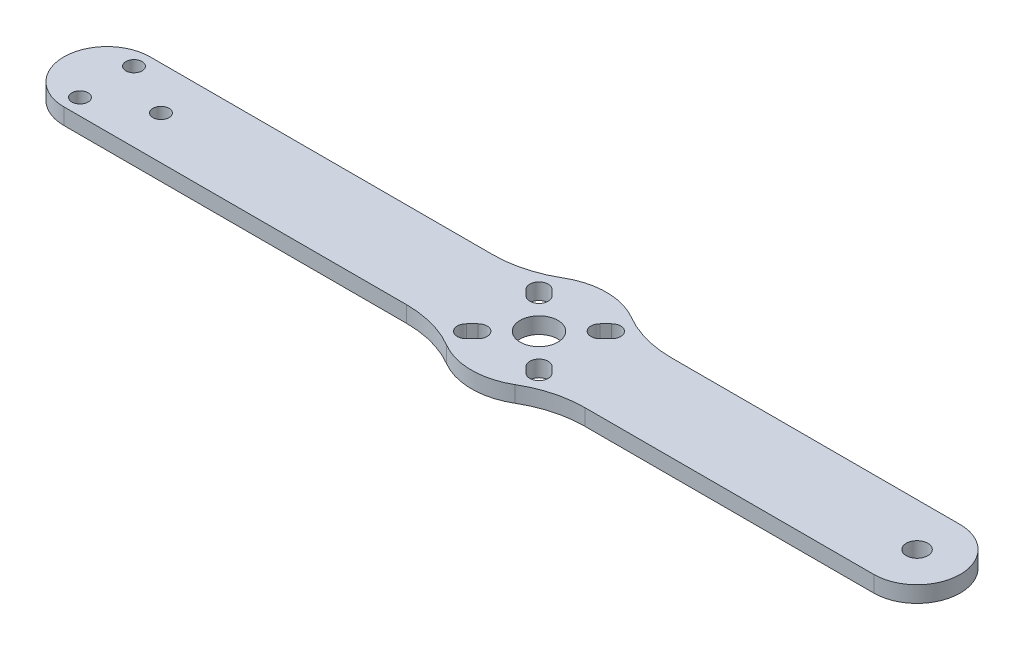
ISO-10303-21;
HEADER;
FILE_DESCRIPTION(('STEP AP214'),'2;1');
FILE_NAME('part.step','',(''),(''),'','','');
FILE_SCHEMA(('AUTOMOTIVE_DESIGN { 1 0 10303 214 1 1 1 1 }'));
ENDSEC;
DATA;
#1=APPLICATION_CONTEXT('core data for automotive mechanical design processes');
#2=APPLICATION_PROTOCOL_DEFINITION('international standard','automotive_design',2000,#1);
#3=PRODUCT_CONTEXT('',#1,'mechanical');
#4=PRODUCT('Part','Part','',(#3));
#5=PRODUCT_RELATED_PRODUCT_CATEGORY('part','',(#4));
#6=PRODUCT_DEFINITION_FORMATION('','',#4);
#7=PRODUCT_DEFINITION_CONTEXT('part definition',#1,'design');
#8=PRODUCT_DEFINITION('design','',#6,#7);
#9=PRODUCT_DEFINITION_SHAPE('','',#8);
#10=(LENGTH_UNIT() NAMED_UNIT(*) SI_UNIT(.MILLI.,.METRE.));
#11=(NAMED_UNIT(*) PLANE_ANGLE_UNIT() SI_UNIT($,.RADIAN.));
#12=(NAMED_UNIT(*) SI_UNIT($,.STERADIAN.) SOLID_ANGLE_UNIT());
#13=UNCERTAINTY_MEASURE_WITH_UNIT(LENGTH_MEASURE(1.E-05),#10,'distance_accuracy_value','');
#14=(GEOMETRIC_REPRESENTATION_CONTEXT(3) GLOBAL_UNCERTAINTY_ASSIGNED_CONTEXT((#13)) GLOBAL_UNIT_ASSIGNED_CONTEXT((#10,
#11,#12)) REPRESENTATION_CONTEXT('',''));
#15=CARTESIAN_POINT('',(0.,0.,0.));
#16=DIRECTION('',(0.,0.,1.));
#17=DIRECTION('',(1.,0.,0.));
#18=AXIS2_PLACEMENT_3D('',#15,#16,#17);
#19=CARTESIAN_POINT('',(0.,3.,8.));
#20=DIRECTION('',(0.,0.,-1.));
#21=DIRECTION('',(-1.,0.,0.));
#22=AXIS2_PLACEMENT_3D('',#19,#20,#21);
#23=PLANE('',#22);
#24=DIRECTION('',(1.,0.,0.));
#25=VECTOR('',#24,1.);
#26=CARTESIAN_POINT('',(0.,0.,8.));
#27=LINE('',#26,#25);
#28=CARTESIAN_POINT('',(0.,0.,8.));
#29=VERTEX_POINT('',#28);
#30=CARTESIAN_POINT('',(63.5,0.,8.));
#31=VERTEX_POINT('',#30);
#32=EDGE_CURVE('E456',#29,#31,#27,.T.);
#33=ORIENTED_EDGE('',*,*,#32,.T.);
#34=DIRECTION('',(0.,1.,0.));
#35=VECTOR('',#34,1.);
#36=CARTESIAN_POINT('',(63.5,3.,8.));
#37=LINE('',#36,#35);
#38=CARTESIAN_POINT('',(63.5,3.,8.));
#39=VERTEX_POINT('',#38);
#40=EDGE_CURVE('E482',#31,#39,#37,.T.);
#41=ORIENTED_EDGE('',*,*,#40,.T.);
#42=DIRECTION('',(1.,0.,0.));
#43=VECTOR('',#42,1.);
#44=CARTESIAN_POINT('',(0.,3.,8.));
#45=LINE('',#44,#43);
#46=CARTESIAN_POINT('',(0.,3.,8.));
#47=VERTEX_POINT('',#46);
#48=EDGE_CURVE('E439',#47,#39,#45,.T.);
#49=ORIENTED_EDGE('',*,*,#48,.F.);
#50=DIRECTION('',(0.,-1.,0.));
#51=VECTOR('',#50,1.);
#52=CARTESIAN_POINT('',(0.,3.,8.));
#53=LINE('',#52,#51);
#54=EDGE_CURVE('E478',#47,#29,#53,.T.);
#55=ORIENTED_EDGE('',*,*,#54,.T.);
#56=EDGE_LOOP('',(#33,#41,#49,#55));
#57=FACE_BOUND('',#56,.T.);
#58=ADVANCED_FACE('F39',(#57),#23,.F.);
#59=CARTESIAN_POINT('',(0.,3.,-8.));
#60=DIRECTION('',(0.,0.,1.));
#61=DIRECTION('',(1.,0.,0.));
#62=AXIS2_PLACEMENT_3D('',#59,#60,#61);
#63=PLANE('',#62);
#64=DIRECTION('',(-1.,0.,0.));
#65=VECTOR('',#64,1.);
#66=CARTESIAN_POINT('',(0.,0.,-8.));
#67=LINE('',#66,#65);
#68=CARTESIAN_POINT('',(150.,0.,-8.));
#69=VERTEX_POINT('',#68);
#70=CARTESIAN_POINT('',(96.5,0.,-8.));
#71=VERTEX_POINT('',#70);
#72=EDGE_CURVE('E438',#69,#71,#67,.T.);
#73=ORIENTED_EDGE('',*,*,#72,.T.);
#74=DIRECTION('',(0.,1.,0.));
#75=VECTOR('',#74,1.);
#76=CARTESIAN_POINT('',(96.5,3.,-8.));
#77=LINE('',#76,#75);
#78=CARTESIAN_POINT('',(96.5,3.,-8.));
#79=VERTEX_POINT('',#78);
#80=EDGE_CURVE('E496',#71,#79,#77,.T.);
#81=ORIENTED_EDGE('',*,*,#80,.T.);
#82=DIRECTION('',(-1.,0.,0.));
#83=VECTOR('',#82,1.);
#84=CARTESIAN_POINT('',(0.,3.,-8.));
#85=LINE('',#84,#83);
#86=CARTESIAN_POINT('',(150.,3.,-8.));
#87=VERTEX_POINT('',#86);
#88=EDGE_CURVE('E447',#87,#79,#85,.T.);
#89=ORIENTED_EDGE('',*,*,#88,.F.);
#90=DIRECTION('',(0.,-1.,0.));
#91=VECTOR('',#90,1.);
#92=CARTESIAN_POINT('',(150.,3.,-8.));
#93=LINE('',#92,#91);
#94=EDGE_CURVE('E470',#87,#69,#93,.T.);
#95=ORIENTED_EDGE('',*,*,#94,.T.);
#96=EDGE_LOOP('',(#73,#81,#89,#95));
#97=FACE_BOUND('',#96,.T.);
#98=ADVANCED_FACE('F571',(#97),#63,.F.);
#99=CARTESIAN_POINT('',(0.,3.,0.));
#100=DIRECTION('',(0.,-1.,0.));
#101=DIRECTION('',(0.,0.,-1.));
#102=AXIS2_PLACEMENT_3D('',#99,#100,#101);
#103=CYLINDRICAL_SURFACE('',#102,8.);
#104=CARTESIAN_POINT('',(0.,0.,0.));
#105=DIRECTION('',(0.,1.,0.));
#106=DIRECTION('',(0.,0.,1.));
#107=AXIS2_PLACEMENT_3D('',#104,#105,#106);
#108=CIRCLE('',#107,8.);
#109=CARTESIAN_POINT('',(0.,0.,-8.));
#110=VERTEX_POINT('',#109);
#111=EDGE_CURVE('E428',#110,#29,#108,.T.);
#112=ORIENTED_EDGE('',*,*,#111,.T.);
#113=ORIENTED_EDGE('',*,*,#54,.F.);
#114=CARTESIAN_POINT('',(0.,3.,0.));
#115=DIRECTION('',(0.,1.,0.));
#116=DIRECTION('',(0.,0.,1.));
#117=AXIS2_PLACEMENT_3D('',#114,#115,#116);
#118=CIRCLE('',#117,8.);
#119=CARTESIAN_POINT('',(0.,3.,-8.));
#120=VERTEX_POINT('',#119);
#121=EDGE_CURVE('E433',#120,#47,#118,.T.);
#122=ORIENTED_EDGE('',*,*,#121,.F.);
#123=DIRECTION('',(0.,-1.,0.));
#124=VECTOR('',#123,1.);
#125=CARTESIAN_POINT('',(0.,3.,-8.));
#126=LINE('',#125,#124);
#127=EDGE_CURVE('E451',#120,#110,#126,.T.);
#128=ORIENTED_EDGE('',*,*,#127,.T.);
#129=EDGE_LOOP('',(#112,#113,#122,#128));
#130=FACE_BOUND('',#129,.T.);
#131=ADVANCED_FACE('F589',(#130),#103,.T.);
#132=CARTESIAN_POINT('',(96.5,3.,8.));
#133=VERTEX_POINT('',#132);
#134=CARTESIAN_POINT('',(150.,3.,8.));
#135=VERTEX_POINT('',#134);
#136=EDGE_CURVE('E437',#133,#135,#45,.T.);
#137=ORIENTED_EDGE('',*,*,#136,.F.);
#138=DIRECTION('',(0.,1.,0.));
#139=VECTOR('',#138,1.);
#140=CARTESIAN_POINT('',(96.5,3.,8.));
#141=LINE('',#140,#139);
#142=CARTESIAN_POINT('',(96.5,0.,8.));
#143=VERTEX_POINT('',#142);
#144=EDGE_CURVE('E492',#133,#143,#141,.F.);
#145=ORIENTED_EDGE('',*,*,#144,.T.);
#146=CARTESIAN_POINT('',(150.,0.,8.));
#147=VERTEX_POINT('',#146);
#148=EDGE_CURVE('E455',#143,#147,#27,.T.);
#149=ORIENTED_EDGE('',*,*,#148,.T.);
#150=DIRECTION('',(0.,-1.,0.));
#151=VECTOR('',#150,1.);
#152=CARTESIAN_POINT('',(150.,3.,8.));
#153=LINE('',#152,#151);
#154=EDGE_CURVE('E474',#135,#147,#153,.T.);
#155=ORIENTED_EDGE('',*,*,#154,.F.);
#156=EDGE_LOOP('',(#137,#145,#149,#155));
#157=FACE_BOUND('',#156,.T.);
#158=ADVANCED_FACE('F560',(#157),#23,.F.);
#159=CARTESIAN_POINT('',(150.,3.,0.));
#160=DIRECTION('',(0.,-1.,0.));
#161=DIRECTION('',(0.,0.,-1.));
#162=AXIS2_PLACEMENT_3D('',#159,#160,#161);
#163=CYLINDRICAL_SURFACE('',#162,8.);
#164=CARTESIAN_POINT('',(150.,0.,0.));
#165=DIRECTION('',(0.,1.,0.));
#166=DIRECTION('',(0.,0.,1.));
#167=AXIS2_PLACEMENT_3D('',#164,#165,#166);
#168=CIRCLE('',#167,8.);
#169=EDGE_CURVE('E460',#147,#69,#168,.T.);
#170=ORIENTED_EDGE('',*,*,#169,.T.);
#171=ORIENTED_EDGE('',*,*,#94,.F.);
#172=CARTESIAN_POINT('',(150.,3.,0.));
#173=DIRECTION('',(0.,1.,0.));
#174=DIRECTION('',(0.,0.,1.));
#175=AXIS2_PLACEMENT_3D('',#172,#173,#174);
#176=CIRCLE('',#175,8.);
#177=EDGE_CURVE('E443',#135,#87,#176,.T.);
#178=ORIENTED_EDGE('',*,*,#177,.F.);
#179=ORIENTED_EDGE('',*,*,#154,.T.);
#180=EDGE_LOOP('',(#170,#171,#178,#179));
#181=FACE_BOUND('',#180,.T.);
#182=ADVANCED_FACE('F567',(#181),#163,.T.);
#183=CARTESIAN_POINT('',(63.5,3.,-8.));
#184=VERTEX_POINT('',#183);
#185=EDGE_CURVE('E446',#184,#120,#85,.T.);
#186=ORIENTED_EDGE('',*,*,#185,.F.);
#187=DIRECTION('',(0.,1.,0.));
#188=VECTOR('',#187,1.);
#189=CARTESIAN_POINT('',(63.5,3.,-8.));
#190=LINE('',#189,#188);
#191=CARTESIAN_POINT('',(63.5,0.,-8.));
#192=VERTEX_POINT('',#191);
#193=EDGE_CURVE('E506',#184,#192,#190,.F.);
#194=ORIENTED_EDGE('',*,*,#193,.T.);
#195=EDGE_CURVE('E463',#192,#110,#67,.T.);
#196=ORIENTED_EDGE('',*,*,#195,.T.);
#197=ORIENTED_EDGE('',*,*,#127,.F.);
#198=EDGE_LOOP('',(#186,#194,#196,#197));
#199=FACE_BOUND('',#198,.T.);
#200=ADVANCED_FACE('F537',(#199),#63,.F.);
#201=CARTESIAN_POINT('',(0.,3.,0.));
#202=DIRECTION('',(0.,1.,0.));
#203=DIRECTION('',(0.,0.,1.));
#204=AXIS2_PLACEMENT_3D('',#201,#202,#203);
#205=PLANE('',#204);
#206=CARTESIAN_POINT('',(150.,3.,0.));
#207=DIRECTION('',(0.,1.,0.));
#208=DIRECTION('',(0.,0.,1.));
#209=AXIS2_PLACEMENT_3D('',#206,#207,#208);
#210=CIRCLE('',#209,2.);
#211=CARTESIAN_POINT('',(150.,3.,2.));
#212=VERTEX_POINT('',#211);
#213=EDGE_CURVE('E956',#212,#212,#210,.T.);
#214=ORIENTED_EDGE('',*,*,#213,.F.);
#215=EDGE_LOOP('',(#214));
#216=FACE_BOUND('',#215,.T.);
#217=CARTESIAN_POINT('',(10.,3.,0.));
#218=DIRECTION('',(0.,1.,0.));
#219=DIRECTION('',(0.,0.,1.));
#220=AXIS2_PLACEMENT_3D('',#217,#218,#219);
#221=CIRCLE('',#220,1.5);
#222=CARTESIAN_POINT('',(10.,3.,1.5));
#223=VERTEX_POINT('',#222);
#224=EDGE_CURVE('E965',#223,#223,#221,.T.);
#225=ORIENTED_EDGE('',*,*,#224,.F.);
#226=EDGE_LOOP('',(#225));
#227=FACE_BOUND('',#226,.T.);
#228=CARTESIAN_POINT('',(0.,3.,-5.));
#229=DIRECTION('',(0.,1.,0.));
#230=DIRECTION('',(0.,0.,1.));
#231=AXIS2_PLACEMENT_3D('',#228,#229,#230);
#232=CIRCLE('',#231,1.5);
#233=CARTESIAN_POINT('',(0.,3.,-3.5));
#234=VERTEX_POINT('',#233);
#235=EDGE_CURVE('E954',#234,#234,#232,.T.);
#236=ORIENTED_EDGE('',*,*,#235,.F.);
#237=EDGE_LOOP('',(#236));
#238=FACE_BOUND('',#237,.T.);
#239=CARTESIAN_POINT('',(0.,3.,5.));
#240=DIRECTION('',(0.,1.,0.));
#241=DIRECTION('',(0.,0.,1.));
#242=AXIS2_PLACEMENT_3D('',#239,#240,#241);
#243=CIRCLE('',#242,1.5);
#244=CARTESIAN_POINT('',(0.,3.,6.5));
#245=VERTEX_POINT('',#244);
#246=EDGE_CURVE('E259',#245,#245,#243,.T.);
#247=ORIENTED_EDGE('',*,*,#246,.F.);
#248=EDGE_LOOP('',(#247));
#249=FACE_BOUND('',#248,.T.);
#250=CARTESIAN_POINT('',(74.3431457505076,3.,-5.65685424949287));
#251=DIRECTION('',(0.,1.,0.));
#252=DIRECTION('',(0.,0.,1.));
#253=AXIS2_PLACEMENT_3D('',#250,#251,#252);
#254=CIRCLE('',#253,1.6979115544887);
#255=CARTESIAN_POINT('',(73.1425409764736,3.,-4.45624947545895));
#256=VERTEX_POINT('',#255);
#257=CARTESIAN_POINT('',(75.5437505245415,3.,-6.85745902352682));
#258=VERTEX_POINT('',#257);
#259=EDGE_CURVE('E390',#256,#258,#254,.T.);
#260=ORIENTED_EDGE('',*,*,#259,.F.);
#261=DIRECTION('',(0.707106781186543,0.,0.707106781186552));
#262=VECTOR('',#261,1.);
#263=CARTESIAN_POINT('',(73.1425409764736,3.,-4.45624947545895));
#264=LINE('',#263,#262);
#265=CARTESIAN_POINT('',(72.0818808046938,3.,-5.51690964723878));
#266=VERTEX_POINT('',#265);
#267=EDGE_CURVE('E377',#266,#256,#264,.T.);
#268=ORIENTED_EDGE('',*,*,#267,.F.);
#269=CARTESIAN_POINT('',(73.2824855787278,3.,-6.71751442127272));
#270=DIRECTION('',(0.,1.,0.));
#271=DIRECTION('',(0.,0.,1.));
#272=AXIS2_PLACEMENT_3D('',#269,#270,#271);
#273=CIRCLE('',#272,1.69791155448871);
#274=CARTESIAN_POINT('',(74.4830903527617,3.,-7.91811919530665));
#275=VERTEX_POINT('',#274);
#276=EDGE_CURVE('E398',#275,#266,#273,.T.);
#277=ORIENTED_EDGE('',*,*,#276,.F.);
#278=DIRECTION('',(-0.707106781186534,0.,-0.707106781186561));
#279=VECTOR('',#278,1.);
#280=CARTESIAN_POINT('',(75.5437505245415,3.,-6.85745902352682));
#281=LINE('',#280,#279);
#282=EDGE_CURVE('E393',#258,#275,#281,.T.);
#283=ORIENTED_EDGE('',*,*,#282,.F.);
#284=EDGE_LOOP('',(#260,#268,#277,#283));
#285=FACE_BOUND('',#284,.T.);
#286=CARTESIAN_POINT('',(74.3431457505076,3.,5.65685424949184));
#287=DIRECTION('',(0.,1.,0.));
#288=DIRECTION('',(0.,0.,1.));
#289=AXIS2_PLACEMENT_3D('',#286,#287,#288);
#290=CIRCLE('',#289,1.6979115544887);
#291=CARTESIAN_POINT('',(75.5437505245415,3.,6.85745902352582));
#292=VERTEX_POINT('',#291);
#293=CARTESIAN_POINT('',(73.1425409764736,3.,4.45624947545789));
#294=VERTEX_POINT('',#293);
#295=EDGE_CURVE('E346',#292,#294,#290,.T.);
#296=ORIENTED_EDGE('',*,*,#295,.F.);
#297=DIRECTION('',(0.707106781186557,0.,-0.707106781186538));
#298=VECTOR('',#297,1.);
#299=CARTESIAN_POINT('',(75.5437505245415,3.,6.85745902352582));
#300=LINE('',#299,#298);
#301=CARTESIAN_POINT('',(74.4830903527617,3.,7.91811919530564));
#302=VERTEX_POINT('',#301);
#303=EDGE_CURVE('E333',#302,#292,#300,.T.);
#304=ORIENTED_EDGE('',*,*,#303,.F.);
#305=CARTESIAN_POINT('',(73.2824855787277,3.,6.71751442127167));
#306=DIRECTION('',(0.,1.,0.));
#307=DIRECTION('',(0.,0.,1.));
#308=AXIS2_PLACEMENT_3D('',#305,#306,#307);
#309=CIRCLE('',#308,1.6979115544887);
#310=CARTESIAN_POINT('',(72.0818808046938,3.,5.51690964723769));
#311=VERTEX_POINT('',#310);
#312=EDGE_CURVE('E354',#311,#302,#309,.T.);
#313=ORIENTED_EDGE('',*,*,#312,.F.);
#314=DIRECTION('',(-0.707106781186558,0.,0.707106781186537));
#315=VECTOR('',#314,1.);
#316=CARTESIAN_POINT('',(73.1425409764736,3.,4.45624947545789));
#317=LINE('',#316,#315);
#318=EDGE_CURVE('E349',#294,#311,#317,.T.);
#319=ORIENTED_EDGE('',*,*,#318,.F.);
#320=EDGE_LOOP('',(#296,#304,#313,#319));
#321=FACE_BOUND('',#320,.T.);
#322=CARTESIAN_POINT('',(85.6568542494923,3.,5.65685424949184));
#323=DIRECTION('',(0.,1.,0.));
#324=DIRECTION('',(0.,0.,1.));
#325=AXIS2_PLACEMENT_3D('',#322,#323,#324);
#326=CIRCLE('',#325,1.6979115544887);
#327=CARTESIAN_POINT('',(86.8574590235263,3.,4.45624947545792));
#328=VERTEX_POINT('',#327);
#329=CARTESIAN_POINT('',(84.4562494754584,3.,6.85745902352579));
#330=VERTEX_POINT('',#329);
#331=EDGE_CURVE('E302',#328,#330,#326,.T.);
#332=ORIENTED_EDGE('',*,*,#331,.F.);
#333=DIRECTION('',(-0.707106781186543,0.,-0.707106781186552));
#334=VECTOR('',#333,1.);
#335=CARTESIAN_POINT('',(86.8574590235263,3.,4.45624947545792));
#336=LINE('',#335,#334);
#337=CARTESIAN_POINT('',(87.9181191953061,3.,5.51690964723775));
#338=VERTEX_POINT('',#337);
#339=EDGE_CURVE('E289',#338,#328,#336,.T.);
#340=ORIENTED_EDGE('',*,*,#339,.F.);
#341=CARTESIAN_POINT('',(86.7175144212722,3.,6.71751442127168));
#342=DIRECTION('',(0.,1.,0.));
#343=DIRECTION('',(0.,0.,1.));
#344=AXIS2_PLACEMENT_3D('',#341,#342,#343);
#345=CIRCLE('',#344,1.69791155448871);
#346=CARTESIAN_POINT('',(85.5169096472382,3.,7.91811919530561));
#347=VERTEX_POINT('',#346);
#348=EDGE_CURVE('E310',#347,#338,#345,.T.);
#349=ORIENTED_EDGE('',*,*,#348,.F.);
#350=DIRECTION('',(0.707106781186534,0.,0.707106781186561));
#351=VECTOR('',#350,1.);
#352=CARTESIAN_POINT('',(84.4562494754584,3.,6.85745902352579));
#353=LINE('',#352,#351);
#354=EDGE_CURVE('E305',#330,#347,#353,.T.);
#355=ORIENTED_EDGE('',*,*,#354,.F.);
#356=EDGE_LOOP('',(#332,#340,#349,#355));
#357=FACE_BOUND('',#356,.T.);
#358=CARTESIAN_POINT('',(85.6568542494923,3.,-5.65685424949296));
#359=DIRECTION('',(0.,1.,0.));
#360=DIRECTION('',(0.,0.,1.));
#361=AXIS2_PLACEMENT_3D('',#358,#359,#360);
#362=CIRCLE('',#361,1.69791155448878);
#363=CARTESIAN_POINT('',(84.4562494754584,3.,-6.85745902352686));
#364=VERTEX_POINT('',#363);
#365=CARTESIAN_POINT('',(86.8574590235263,3.,-4.45624947545877));
#366=VERTEX_POINT('',#365);
#367=EDGE_CURVE('E231',#364,#366,#362,.T.);
#368=ORIENTED_EDGE('',*,*,#367,.F.);
#369=DIRECTION('',(-0.707106781186553,0.,0.707106781186542));
#370=VECTOR('',#369,1.);
#371=CARTESIAN_POINT('',(84.4562494754584,3.,-6.85745902352686));
#372=LINE('',#371,#370);
#373=CARTESIAN_POINT('',(85.5169096472382,3.,-7.91811919530667));
#374=VERTEX_POINT('',#373);
#375=EDGE_CURVE('E252',#374,#364,#372,.T.);
#376=ORIENTED_EDGE('',*,*,#375,.F.);
#377=CARTESIAN_POINT('',(86.7175144212722,3.,-6.71751442127273));
#378=DIRECTION('',(0.,1.,0.));
#379=DIRECTION('',(0.,0.,1.));
#380=AXIS2_PLACEMENT_3D('',#377,#378,#379);
#381=CIRCLE('',#380,1.69791155448878);
#382=CARTESIAN_POINT('',(87.9181191953061,3.,-5.51690964723863));
#383=VERTEX_POINT('',#382);
#384=EDGE_CURVE('E256',#383,#374,#381,.T.);
#385=ORIENTED_EDGE('',*,*,#384,.F.);
#386=DIRECTION('',(0.707106781186547,0.,-0.707106781186547));
#387=VECTOR('',#386,1.);
#388=CARTESIAN_POINT('',(86.8574590235263,3.,-4.45624947545876));
#389=LINE('',#388,#387);
#390=EDGE_CURVE('E268',#366,#383,#389,.T.);
#391=ORIENTED_EDGE('',*,*,#390,.F.);
#392=EDGE_LOOP('',(#368,#376,#385,#391));
#393=FACE_BOUND('',#392,.T.);
#394=CARTESIAN_POINT('',(79.9999999999999,3.,-6.06775432368231E-13));
#395=DIRECTION('',(0.,1.,0.));
#396=DIRECTION('',(0.,0.,1.));
#397=AXIS2_PLACEMENT_3D('',#394,#395,#396);
#398=CIRCLE('',#397,3.49999999999998);
#399=CARTESIAN_POINT('',(79.9999999999999,3.,3.49999999999938));
#400=VERTEX_POINT('',#399);
#401=EDGE_CURVE('E278',#400,#400,#398,.T.);
#402=ORIENTED_EDGE('',*,*,#401,.F.);
#403=EDGE_LOOP('',(#402));
#404=FACE_BOUND('',#403,.T.);
#405=ORIENTED_EDGE('',*,*,#48,.T.);
#406=CARTESIAN_POINT('',(63.5,3.,28.));
#407=DIRECTION('',(0.,1.,0.));
#408=DIRECTION('',(0.,0.,1.));
#409=AXIS2_PLACEMENT_3D('',#406,#407,#408);
#410=CIRCLE('',#409,20.);
#411=CARTESIAN_POINT('',(73.6538461538461,3.,10.7692307692308));
#412=VERTEX_POINT('',#411);
#413=EDGE_CURVE('E509',#39,#412,#410,.F.);
#414=ORIENTED_EDGE('',*,*,#413,.T.);
#415=CARTESIAN_POINT('',(80.,3.,0.));
#416=DIRECTION('',(0.,1.,0.));
#417=DIRECTION('',(0.,0.,1.));
#418=AXIS2_PLACEMENT_3D('',#415,#416,#417);
#419=CIRCLE('',#418,12.5);
#420=CARTESIAN_POINT('',(86.3461538461539,3.,10.7692307692308));
#421=VERTEX_POINT('',#420);
#422=EDGE_CURVE('E420',#412,#421,#419,.T.);
#423=ORIENTED_EDGE('',*,*,#422,.T.);
#424=CARTESIAN_POINT('',(96.5,3.,28.));
#425=DIRECTION('',(0.,1.,0.));
#426=DIRECTION('',(0.,0.,1.));
#427=AXIS2_PLACEMENT_3D('',#424,#425,#426);
#428=CIRCLE('',#427,20.);
#429=EDGE_CURVE('E518',#421,#133,#428,.F.);
#430=ORIENTED_EDGE('',*,*,#429,.T.);
#431=ORIENTED_EDGE('',*,*,#136,.T.);
#432=ORIENTED_EDGE('',*,*,#177,.T.);
#433=ORIENTED_EDGE('',*,*,#88,.T.);
#434=CARTESIAN_POINT('',(96.5,3.,-28.));
#435=DIRECTION('',(0.,1.,0.));
#436=DIRECTION('',(0.,0.,1.));
#437=AXIS2_PLACEMENT_3D('',#434,#435,#436);
#438=CIRCLE('',#437,20.);
#439=CARTESIAN_POINT('',(86.3461538461539,3.,-10.7692307692308));
#440=VERTEX_POINT('',#439);
#441=EDGE_CURVE('E521',#79,#440,#438,.F.);
#442=ORIENTED_EDGE('',*,*,#441,.T.);
#443=CARTESIAN_POINT('',(73.6538461538461,3.,-10.7692307692308));
#444=VERTEX_POINT('',#443);
#445=EDGE_CURVE('E430',#440,#444,#419,.T.);
#446=ORIENTED_EDGE('',*,*,#445,.T.);
#447=CARTESIAN_POINT('',(63.5,3.,-28.));
#448=DIRECTION('',(0.,1.,0.));
#449=DIRECTION('',(0.,0.,1.));
#450=AXIS2_PLACEMENT_3D('',#447,#448,#449);
#451=CIRCLE('',#450,20.);
#452=EDGE_CURVE('E11',#444,#184,#451,.F.);
#453=ORIENTED_EDGE('',*,*,#452,.T.);
#454=ORIENTED_EDGE('',*,*,#185,.T.);
#455=ORIENTED_EDGE('',*,*,#121,.T.);
#456=EDGE_LOOP('',(#405,#414,#423,#430,#431,#432,#433,#442,#446,#453,#454,#455));
#457=FACE_BOUND('',#456,.T.);
#458=ADVANCED_FACE('F550',(#216,#227,#238,#249,#285,#321,#357,#393,#404,#457),#205,.T.);
#459=CARTESIAN_POINT('',(0.,0.,0.));
#460=DIRECTION('',(0.,1.,0.));
#461=DIRECTION('',(0.,0.,1.));
#462=AXIS2_PLACEMENT_3D('',#459,#460,#461);
#463=PLANE('',#462);
#464=CARTESIAN_POINT('',(150.,0.,0.));
#465=DIRECTION('',(0.,1.,0.));
#466=DIRECTION('',(0.,0.,1.));
#467=AXIS2_PLACEMENT_3D('',#464,#465,#466);
#468=CIRCLE('',#467,2.);
#469=CARTESIAN_POINT('',(150.,0.,2.));
#470=VERTEX_POINT('',#469);
#471=EDGE_CURVE('E951',#470,#470,#468,.T.);
#472=ORIENTED_EDGE('',*,*,#471,.T.);
#473=EDGE_LOOP('',(#472));
#474=FACE_BOUND('',#473,.T.);
#475=CARTESIAN_POINT('',(10.,0.,0.));
#476=DIRECTION('',(0.,1.,0.));
#477=DIRECTION('',(0.,0.,1.));
#478=AXIS2_PLACEMENT_3D('',#475,#476,#477);
#479=CIRCLE('',#478,1.5);
#480=CARTESIAN_POINT('',(10.,0.,1.5));
#481=VERTEX_POINT('',#480);
#482=EDGE_CURVE('E394',#481,#481,#479,.T.);
#483=ORIENTED_EDGE('',*,*,#482,.T.);
#484=EDGE_LOOP('',(#483));
#485=FACE_BOUND('',#484,.T.);
#486=CARTESIAN_POINT('',(0.,0.,-5.));
#487=DIRECTION('',(0.,1.,0.));
#488=DIRECTION('',(0.,0.,1.));
#489=AXIS2_PLACEMENT_3D('',#486,#487,#488);
#490=CIRCLE('',#489,1.5);
#491=CARTESIAN_POINT('',(0.,0.,-3.5));
#492=VERTEX_POINT('',#491);
#493=EDGE_CURVE('E969',#492,#492,#490,.T.);
#494=ORIENTED_EDGE('',*,*,#493,.T.);
#495=EDGE_LOOP('',(#494));
#496=FACE_BOUND('',#495,.T.);
#497=CARTESIAN_POINT('',(0.,0.,5.));
#498=DIRECTION('',(0.,1.,0.));
#499=DIRECTION('',(0.,0.,1.));
#500=AXIS2_PLACEMENT_3D('',#497,#498,#499);
#501=CIRCLE('',#500,1.5);
#502=CARTESIAN_POINT('',(0.,0.,6.5));
#503=VERTEX_POINT('',#502);
#504=EDGE_CURVE('E946',#503,#503,#501,.T.);
#505=ORIENTED_EDGE('',*,*,#504,.T.);
#506=EDGE_LOOP('',(#505));
#507=FACE_BOUND('',#506,.T.);
#508=DIRECTION('',(0.707106781186543,0.,0.707106781186552));
#509=VECTOR('',#508,1.);
#510=CARTESIAN_POINT('',(73.1425409764736,0.,-4.45624947545895));
#511=LINE('',#510,#509);
#512=CARTESIAN_POINT('',(72.0818808046938,0.,-5.51690964723878));
#513=VERTEX_POINT('',#512);
#514=CARTESIAN_POINT('',(73.1425409764736,0.,-4.45624947545895));
#515=VERTEX_POINT('',#514);
#516=EDGE_CURVE('E385',#513,#515,#511,.T.);
#517=ORIENTED_EDGE('',*,*,#516,.T.);
#518=CARTESIAN_POINT('',(74.3431457505076,0.,-5.65685424949287));
#519=DIRECTION('',(0.,1.,0.));
#520=DIRECTION('',(0.,0.,1.));
#521=AXIS2_PLACEMENT_3D('',#518,#519,#520);
#522=CIRCLE('',#521,1.6979115544887);
#523=CARTESIAN_POINT('',(75.5437505245415,0.,-6.85745902352682));
#524=VERTEX_POINT('',#523);
#525=EDGE_CURVE('E372',#515,#524,#522,.T.);
#526=ORIENTED_EDGE('',*,*,#525,.T.);
#527=DIRECTION('',(-0.707106781186534,0.,-0.707106781186561));
#528=VECTOR('',#527,1.);
#529=CARTESIAN_POINT('',(75.5437505245415,0.,-6.85745902352682));
#530=LINE('',#529,#528);
#531=CARTESIAN_POINT('',(74.4830903527618,0.,-7.91811919530665));
#532=VERTEX_POINT('',#531);
#533=EDGE_CURVE('E376',#524,#532,#530,.T.);
#534=ORIENTED_EDGE('',*,*,#533,.T.);
#535=CARTESIAN_POINT('',(73.2824855787278,0.,-6.71751442127272));
#536=DIRECTION('',(0.,1.,0.));
#537=DIRECTION('',(0.,0.,1.));
#538=AXIS2_PLACEMENT_3D('',#535,#536,#537);
#539=CIRCLE('',#538,1.69791155448871);
#540=EDGE_CURVE('E381',#532,#513,#539,.T.);
#541=ORIENTED_EDGE('',*,*,#540,.T.);
#542=EDGE_LOOP('',(#517,#526,#534,#541));
#543=FACE_BOUND('',#542,.T.);
#544=DIRECTION('',(0.707106781186557,0.,-0.707106781186538));
#545=VECTOR('',#544,1.);
#546=CARTESIAN_POINT('',(75.5437505245415,0.,6.85745902352582));
#547=LINE('',#546,#545);
#548=CARTESIAN_POINT('',(74.4830903527617,0.,7.91811919530564));
#549=VERTEX_POINT('',#548);
#550=CARTESIAN_POINT('',(75.5437505245415,0.,6.85745902352582));
#551=VERTEX_POINT('',#550);
#552=EDGE_CURVE('E341',#549,#551,#547,.T.);
#553=ORIENTED_EDGE('',*,*,#552,.T.);
#554=CARTESIAN_POINT('',(74.3431457505076,0.,5.65685424949184));
#555=DIRECTION('',(0.,1.,0.));
#556=DIRECTION('',(0.,0.,1.));
#557=AXIS2_PLACEMENT_3D('',#554,#555,#556);
#558=CIRCLE('',#557,1.6979115544887);
#559=CARTESIAN_POINT('',(73.1425409764736,0.,4.45624947545789));
#560=VERTEX_POINT('',#559);
#561=EDGE_CURVE('E328',#551,#560,#558,.T.);
#562=ORIENTED_EDGE('',*,*,#561,.T.);
#563=DIRECTION('',(-0.707106781186558,0.,0.707106781186537));
#564=VECTOR('',#563,1.);
#565=CARTESIAN_POINT('',(73.1425409764736,0.,4.45624947545789));
#566=LINE('',#565,#564);
#567=CARTESIAN_POINT('',(72.0818808046938,0.,5.51690964723769));
#568=VERTEX_POINT('',#567);
#569=EDGE_CURVE('E332',#560,#568,#566,.T.);
#570=ORIENTED_EDGE('',*,*,#569,.T.);
#571=CARTESIAN_POINT('',(73.2824855787277,0.,6.71751442127167));
#572=DIRECTION('',(0.,1.,0.));
#573=DIRECTION('',(0.,0.,1.));
#574=AXIS2_PLACEMENT_3D('',#571,#572,#573);
#575=CIRCLE('',#574,1.6979115544887);
#576=EDGE_CURVE('E337',#568,#549,#575,.T.);
#577=ORIENTED_EDGE('',*,*,#576,.T.);
#578=EDGE_LOOP('',(#553,#562,#570,#577));
#579=FACE_BOUND('',#578,.T.);
#580=DIRECTION('',(-0.707106781186543,0.,-0.707106781186552));
#581=VECTOR('',#580,1.);
#582=CARTESIAN_POINT('',(86.8574590235263,0.,4.45624947545792));
#583=LINE('',#582,#581);
#584=CARTESIAN_POINT('',(87.9181191953061,0.,5.51690964723775));
#585=VERTEX_POINT('',#584);
#586=CARTESIAN_POINT('',(86.8574590235263,0.,4.45624947545792));
#587=VERTEX_POINT('',#586);
#588=EDGE_CURVE('E297',#585,#587,#583,.T.);
#589=ORIENTED_EDGE('',*,*,#588,.T.);
#590=CARTESIAN_POINT('',(85.6568542494923,0.,5.65685424949184));
#591=DIRECTION('',(0.,1.,0.));
#592=DIRECTION('',(0.,0.,1.));
#593=AXIS2_PLACEMENT_3D('',#590,#591,#592);
#594=CIRCLE('',#593,1.6979115544887);
#595=CARTESIAN_POINT('',(84.4562494754584,0.,6.85745902352579));
#596=VERTEX_POINT('',#595);
#597=EDGE_CURVE('E284',#587,#596,#594,.T.);
#598=ORIENTED_EDGE('',*,*,#597,.T.);
#599=DIRECTION('',(0.707106781186534,0.,0.707106781186561));
#600=VECTOR('',#599,1.);
#601=CARTESIAN_POINT('',(84.4562494754584,0.,6.85745902352579));
#602=LINE('',#601,#600);
#603=CARTESIAN_POINT('',(85.5169096472381,0.,7.91811919530561));
#604=VERTEX_POINT('',#603);
#605=EDGE_CURVE('E288',#596,#604,#602,.T.);
#606=ORIENTED_EDGE('',*,*,#605,.T.);
#607=CARTESIAN_POINT('',(86.7175144212722,0.,6.71751442127168));
#608=DIRECTION('',(0.,1.,0.));
#609=DIRECTION('',(0.,0.,1.));
#610=AXIS2_PLACEMENT_3D('',#607,#608,#609);
#611=CIRCLE('',#610,1.69791155448871);
#612=EDGE_CURVE('E293',#604,#585,#611,.T.);
#613=ORIENTED_EDGE('',*,*,#612,.T.);
#614=EDGE_LOOP('',(#589,#598,#606,#613));
#615=FACE_BOUND('',#614,.T.);
#616=DIRECTION('',(-0.707106781186553,0.,0.707106781186542));
#617=VECTOR('',#616,1.);
#618=CARTESIAN_POINT('',(84.4562494754584,0.,-6.85745902352686));
#619=LINE('',#618,#617);
#620=CARTESIAN_POINT('',(85.5169096472382,0.,-7.91811919530667));
#621=VERTEX_POINT('',#620);
#622=CARTESIAN_POINT('',(84.4562494754584,0.,-6.85745902352686));
#623=VERTEX_POINT('',#622);
#624=EDGE_CURVE('E237',#621,#623,#619,.T.);
#625=ORIENTED_EDGE('',*,*,#624,.T.);
#626=CARTESIAN_POINT('',(85.6568542494923,0.,-5.65685424949296));
#627=DIRECTION('',(0.,1.,0.));
#628=DIRECTION('',(0.,0.,1.));
#629=AXIS2_PLACEMENT_3D('',#626,#627,#628);
#630=CIRCLE('',#629,1.69791155448878);
#631=CARTESIAN_POINT('',(86.8574590235263,0.,-4.45624947545876));
#632=VERTEX_POINT('',#631);
#633=EDGE_CURVE('E228',#623,#632,#630,.T.);
#634=ORIENTED_EDGE('',*,*,#633,.T.);
#635=DIRECTION('',(0.707106781186547,0.,-0.707106781186547));
#636=VECTOR('',#635,1.);
#637=CARTESIAN_POINT('',(86.8574590235263,0.,-4.45624947545876));
#638=LINE('',#637,#636);
#639=CARTESIAN_POINT('',(87.9181191953061,0.,-5.51690964723857));
#640=VERTEX_POINT('',#639);
#641=EDGE_CURVE('E241',#632,#640,#638,.T.);
#642=ORIENTED_EDGE('',*,*,#641,.T.);
#643=CARTESIAN_POINT('',(86.7175144212722,0.,-6.71751442127273));
#644=DIRECTION('',(0.,1.,0.));
#645=DIRECTION('',(0.,0.,1.));
#646=AXIS2_PLACEMENT_3D('',#643,#644,#645);
#647=CIRCLE('',#646,1.69791155448878);
#648=EDGE_CURVE('E246',#640,#621,#647,.T.);
#649=ORIENTED_EDGE('',*,*,#648,.T.);
#650=EDGE_LOOP('',(#625,#634,#642,#649));
#651=FACE_BOUND('',#650,.T.);
#652=CARTESIAN_POINT('',(79.9999999999999,0.,-6.06775432368231E-13));
#653=DIRECTION('',(0.,1.,0.));
#654=DIRECTION('',(0.,0.,1.));
#655=AXIS2_PLACEMENT_3D('',#652,#653,#654);
#656=CIRCLE('',#655,3.49999999999998);
#657=CARTESIAN_POINT('',(79.9999999999999,0.,3.49999999999938));
#658=VERTEX_POINT('',#657);
#659=EDGE_CURVE('E416',#658,#658,#656,.T.);
#660=ORIENTED_EDGE('',*,*,#659,.T.);
#661=EDGE_LOOP('',(#660));
#662=FACE_BOUND('',#661,.T.);
#663=ORIENTED_EDGE('',*,*,#195,.F.);
#664=CARTESIAN_POINT('',(63.5,0.,-28.));
#665=DIRECTION('',(0.,1.,0.));
#666=DIRECTION('',(0.,0.,1.));
#667=AXIS2_PLACEMENT_3D('',#664,#665,#666);
#668=CIRCLE('',#667,20.);
#669=CARTESIAN_POINT('',(73.6538461538461,0.,-10.7692307692308));
#670=VERTEX_POINT('',#669);
#671=EDGE_CURVE('E48',#192,#670,#668,.T.);
#672=ORIENTED_EDGE('',*,*,#671,.T.);
#673=CARTESIAN_POINT('',(80.,0.,0.));
#674=DIRECTION('',(0.,1.,0.));
#675=DIRECTION('',(0.,0.,1.));
#676=AXIS2_PLACEMENT_3D('',#673,#674,#675);
#677=CIRCLE('',#676,12.5);
#678=CARTESIAN_POINT('',(86.3461538461539,0.,-10.7692307692308));
#679=VERTEX_POINT('',#678);
#680=EDGE_CURVE('E424',#679,#670,#677,.T.);
#681=ORIENTED_EDGE('',*,*,#680,.F.);
#682=CARTESIAN_POINT('',(96.5,0.,-28.));
#683=DIRECTION('',(0.,1.,0.));
#684=DIRECTION('',(0.,0.,1.));
#685=AXIS2_PLACEMENT_3D('',#682,#683,#684);
#686=CIRCLE('',#685,20.);
#687=EDGE_CURVE('E524',#679,#71,#686,.T.);
#688=ORIENTED_EDGE('',*,*,#687,.T.);
#689=ORIENTED_EDGE('',*,*,#72,.F.);
#690=ORIENTED_EDGE('',*,*,#169,.F.);
#691=ORIENTED_EDGE('',*,*,#148,.F.);
#692=CARTESIAN_POINT('',(96.5,0.,28.));
#693=DIRECTION('',(0.,1.,0.));
#694=DIRECTION('',(0.,0.,1.));
#695=AXIS2_PLACEMENT_3D('',#692,#693,#694);
#696=CIRCLE('',#695,20.);
#697=CARTESIAN_POINT('',(86.3461538461539,0.,10.7692307692308));
#698=VERTEX_POINT('',#697);
#699=EDGE_CURVE('E515',#143,#698,#696,.T.);
#700=ORIENTED_EDGE('',*,*,#699,.T.);
#701=CARTESIAN_POINT('',(73.6538461538461,0.,10.7692307692308));
#702=VERTEX_POINT('',#701);
#703=EDGE_CURVE('E429',#702,#698,#677,.T.);
#704=ORIENTED_EDGE('',*,*,#703,.F.);
#705=CARTESIAN_POINT('',(63.5,0.,28.));
#706=DIRECTION('',(0.,1.,0.));
#707=DIRECTION('',(0.,0.,1.));
#708=AXIS2_PLACEMENT_3D('',#705,#706,#707);
#709=CIRCLE('',#708,20.);
#710=EDGE_CURVE('E512',#702,#31,#709,.T.);
#711=ORIENTED_EDGE('',*,*,#710,.T.);
#712=ORIENTED_EDGE('',*,*,#32,.F.);
#713=ORIENTED_EDGE('',*,*,#111,.F.);
#714=EDGE_LOOP('',(#663,#672,#681,#688,#689,#690,#691,#700,#704,#711,#712,#713));
#715=FACE_BOUND('',#714,.T.);
#716=ADVANCED_FACE('F248',(#474,#485,#496,#507,#543,#579,#615,#651,#662,#715),#463,.F.);
#717=CARTESIAN_POINT('',(80.,0.,0.));
#718=DIRECTION('',(0.,1.,0.));
#719=DIRECTION('',(0.,0.,1.));
#720=AXIS2_PLACEMENT_3D('',#717,#718,#719);
#721=CYLINDRICAL_SURFACE('',#720,12.5);
#722=ORIENTED_EDGE('',*,*,#445,.F.);
#723=DIRECTION('',(0.,1.,0.));
#724=VECTOR('',#723,1.);
#725=CARTESIAN_POINT('',(86.3461538461539,0.,-10.7692307692308));
#726=LINE('',#725,#724);
#727=EDGE_CURVE('E503',#440,#679,#726,.F.);
#728=ORIENTED_EDGE('',*,*,#727,.T.);
#729=ORIENTED_EDGE('',*,*,#680,.T.);
#730=DIRECTION('',(0.,1.,0.));
#731=VECTOR('',#730,1.);
#732=CARTESIAN_POINT('',(73.6538461538461,0.,-10.7692307692308));
#733=LINE('',#732,#731);
#734=EDGE_CURVE('E500',#670,#444,#733,.T.);
#735=ORIENTED_EDGE('',*,*,#734,.T.);
#736=EDGE_LOOP('',(#722,#728,#729,#735));
#737=FACE_BOUND('',#736,.T.);
#738=ADVANCED_FACE('F534',(#737),#721,.T.);
#739=ORIENTED_EDGE('',*,*,#422,.F.);
#740=DIRECTION('',(0.,1.,0.));
#741=VECTOR('',#740,1.);
#742=CARTESIAN_POINT('',(73.6538461538461,0.,10.7692307692308));
#743=LINE('',#742,#741);
#744=EDGE_CURVE('E489',#412,#702,#743,.F.);
#745=ORIENTED_EDGE('',*,*,#744,.T.);
#746=ORIENTED_EDGE('',*,*,#703,.T.);
#747=DIRECTION('',(0.,1.,0.));
#748=VECTOR('',#747,1.);
#749=CARTESIAN_POINT('',(86.3461538461539,0.,10.7692307692308));
#750=LINE('',#749,#748);
#751=EDGE_CURVE('E486',#698,#421,#750,.T.);
#752=ORIENTED_EDGE('',*,*,#751,.T.);
#753=EDGE_LOOP('',(#739,#745,#746,#752));
#754=FACE_BOUND('',#753,.T.);
#755=ADVANCED_FACE('F614',(#754),#721,.T.);
#756=CARTESIAN_POINT('',(79.9999999999999,0.,-6.06775432368231E-13));
#757=DIRECTION('',(0.,1.,0.));
#758=DIRECTION('',(0.,0.,1.));
#759=AXIS2_PLACEMENT_3D('',#756,#757,#758);
#760=CYLINDRICAL_SURFACE('',#759,3.49999999999998);
#761=ORIENTED_EDGE('',*,*,#659,.F.);
#762=EDGE_LOOP('',(#761));
#763=FACE_BOUND('',#762,.T.);
#764=ORIENTED_EDGE('',*,*,#401,.T.);
#765=EDGE_LOOP('',(#764));
#766=FACE_BOUND('',#765,.T.);
#767=ADVANCED_FACE('F616',(#763,#766),#760,.F.);
#768=CARTESIAN_POINT('',(85.6568542494923,0.,-5.65685424949296));
#769=DIRECTION('',(0.,1.,0.));
#770=DIRECTION('',(0.,0.,1.));
#771=AXIS2_PLACEMENT_3D('',#768,#769,#770);
#772=CYLINDRICAL_SURFACE('',#771,1.69791155448878);
#773=ORIENTED_EDGE('',*,*,#367,.T.);
#774=DIRECTION('',(0.,1.,0.));
#775=VECTOR('',#774,1.);
#776=CARTESIAN_POINT('',(86.8574590235263,0.,-4.45624947545876));
#777=LINE('',#776,#775);
#778=EDGE_CURVE('E224',#632,#366,#777,.T.);
#779=ORIENTED_EDGE('',*,*,#778,.F.);
#780=ORIENTED_EDGE('',*,*,#633,.F.);
#781=DIRECTION('',(0.,1.,0.));
#782=VECTOR('',#781,1.);
#783=CARTESIAN_POINT('',(84.4562494754584,0.,-6.85745902352686));
#784=LINE('',#783,#782);
#785=EDGE_CURVE('E275',#623,#364,#784,.T.);
#786=ORIENTED_EDGE('',*,*,#785,.T.);
#787=EDGE_LOOP('',(#773,#779,#780,#786));
#788=FACE_BOUND('',#787,.T.);
#789=ADVANCED_FACE('F226',(#788),#772,.F.);
#790=CARTESIAN_POINT('',(84.4562494754584,0.,-6.85745902352686));
#791=DIRECTION('',(-0.707106781186542,0.,-0.707106781186553));
#792=DIRECTION('',(-0.707106781186553,0.,0.707106781186542));
#793=AXIS2_PLACEMENT_3D('',#790,#791,#792);
#794=PLANE('',#793);
#795=ORIENTED_EDGE('',*,*,#375,.T.);
#796=ORIENTED_EDGE('',*,*,#785,.F.);
#797=ORIENTED_EDGE('',*,*,#624,.F.);
#798=DIRECTION('',(0.,1.,0.));
#799=VECTOR('',#798,1.);
#800=CARTESIAN_POINT('',(85.5169096472382,0.,-7.91811919530667));
#801=LINE('',#800,#799);
#802=EDGE_CURVE('E279',#621,#374,#801,.T.);
#803=ORIENTED_EDGE('',*,*,#802,.T.);
#804=EDGE_LOOP('',(#795,#796,#797,#803));
#805=FACE_BOUND('',#804,.T.);
#806=ADVANCED_FACE('F698',(#805),#794,.F.);
#807=CARTESIAN_POINT('',(86.7175144212722,0.,-6.71751442127273));
#808=DIRECTION('',(0.,1.,0.));
#809=DIRECTION('',(0.,0.,1.));
#810=AXIS2_PLACEMENT_3D('',#807,#808,#809);
#811=CYLINDRICAL_SURFACE('',#810,1.69791155448878);
#812=ORIENTED_EDGE('',*,*,#384,.T.);
#813=ORIENTED_EDGE('',*,*,#802,.F.);
#814=ORIENTED_EDGE('',*,*,#648,.F.);
#815=DIRECTION('',(0.,1.,0.));
#816=VECTOR('',#815,1.);
#817=CARTESIAN_POINT('',(87.9181191953061,0.,-5.51690964723863));
#818=LINE('',#817,#816);
#819=EDGE_CURVE('E236',#640,#383,#818,.T.);
#820=ORIENTED_EDGE('',*,*,#819,.T.);
#821=EDGE_LOOP('',(#812,#813,#814,#820));
#822=FACE_BOUND('',#821,.T.);
#823=ADVANCED_FACE('F701',(#822),#811,.F.);
#824=CARTESIAN_POINT('',(86.8574590235263,0.,-4.45624947545876));
#825=DIRECTION('',(0.707106781186548,0.,0.707106781186548));
#826=DIRECTION('',(0.707106781186548,0.,-0.707106781186548));
#827=AXIS2_PLACEMENT_3D('',#824,#825,#826);
#828=PLANE('',#827);
#829=ORIENTED_EDGE('',*,*,#390,.T.);
#830=ORIENTED_EDGE('',*,*,#819,.F.);
#831=ORIENTED_EDGE('',*,*,#641,.F.);
#832=ORIENTED_EDGE('',*,*,#778,.T.);
#833=EDGE_LOOP('',(#829,#830,#831,#832));
#834=FACE_BOUND('',#833,.T.);
#835=ADVANCED_FACE('F242',(#834),#828,.F.);
#836=CARTESIAN_POINT('',(85.6568542494923,0.,5.65685424949184));
#837=DIRECTION('',(0.,1.,0.));
#838=DIRECTION('',(0.,0.,1.));
#839=AXIS2_PLACEMENT_3D('',#836,#837,#838);
#840=CYLINDRICAL_SURFACE('',#839,1.6979115544887);
#841=ORIENTED_EDGE('',*,*,#331,.T.);
#842=DIRECTION('',(0.,1.,0.));
#843=VECTOR('',#842,1.);
#844=CARTESIAN_POINT('',(84.4562494754584,0.,6.85745902352579));
#845=LINE('',#844,#843);
#846=EDGE_CURVE('E301',#596,#330,#845,.T.);
#847=ORIENTED_EDGE('',*,*,#846,.F.);
#848=ORIENTED_EDGE('',*,*,#597,.F.);
#849=DIRECTION('',(0.,1.,0.));
#850=VECTOR('',#849,1.);
#851=CARTESIAN_POINT('',(86.8574590235263,0.,4.45624947545792));
#852=LINE('',#851,#850);
#853=EDGE_CURVE('E269',#587,#328,#852,.T.);
#854=ORIENTED_EDGE('',*,*,#853,.T.);
#855=EDGE_LOOP('',(#841,#847,#848,#854));
#856=FACE_BOUND('',#855,.T.);
#857=ADVANCED_FACE('F708',(#856),#840,.F.);
#858=CARTESIAN_POINT('',(86.8574590235263,0.,4.45624947545792));
#859=DIRECTION('',(0.707106781186552,0.,-0.707106781186543));
#860=DIRECTION('',(-0.707106781186543,0.,-0.707106781186552));
#861=AXIS2_PLACEMENT_3D('',#858,#859,#860);
#862=PLANE('',#861);
#863=ORIENTED_EDGE('',*,*,#339,.T.);
#864=ORIENTED_EDGE('',*,*,#853,.F.);
#865=ORIENTED_EDGE('',*,*,#588,.F.);
#866=DIRECTION('',(0.,1.,0.));
#867=VECTOR('',#866,1.);
#868=CARTESIAN_POINT('',(87.9181191953061,0.,5.51690964723775));
#869=LINE('',#868,#867);
#870=EDGE_CURVE('E319',#585,#338,#869,.T.);
#871=ORIENTED_EDGE('',*,*,#870,.T.);
#872=EDGE_LOOP('',(#863,#864,#865,#871));
#873=FACE_BOUND('',#872,.T.);
#874=ADVANCED_FACE('F711',(#873),#862,.F.);
#875=CARTESIAN_POINT('',(86.7175144212722,0.,6.71751442127168));
#876=DIRECTION('',(0.,1.,0.));
#877=DIRECTION('',(0.,0.,1.));
#878=AXIS2_PLACEMENT_3D('',#875,#876,#877);
#879=CYLINDRICAL_SURFACE('',#878,1.69791155448871);
#880=ORIENTED_EDGE('',*,*,#348,.T.);
#881=ORIENTED_EDGE('',*,*,#870,.F.);
#882=ORIENTED_EDGE('',*,*,#612,.F.);
#883=DIRECTION('',(0.,1.,0.));
#884=VECTOR('',#883,1.);
#885=CARTESIAN_POINT('',(85.5169096472382,0.,7.91811919530561));
#886=LINE('',#885,#884);
#887=EDGE_CURVE('E322',#604,#347,#886,.T.);
#888=ORIENTED_EDGE('',*,*,#887,.T.);
#889=EDGE_LOOP('',(#880,#881,#882,#888));
#890=FACE_BOUND('',#889,.T.);
#891=ADVANCED_FACE('F714',(#890),#879,.F.);
#892=CARTESIAN_POINT('',(84.4562494754584,0.,6.85745902352579));
#893=DIRECTION('',(-0.707106781186561,0.,0.707106781186534));
#894=DIRECTION('',(0.707106781186534,0.,0.707106781186561));
#895=AXIS2_PLACEMENT_3D('',#892,#893,#894);
#896=PLANE('',#895);
#897=ORIENTED_EDGE('',*,*,#354,.T.);
#898=ORIENTED_EDGE('',*,*,#887,.F.);
#899=ORIENTED_EDGE('',*,*,#605,.F.);
#900=ORIENTED_EDGE('',*,*,#846,.T.);
#901=EDGE_LOOP('',(#897,#898,#899,#900));
#902=FACE_BOUND('',#901,.T.);
#903=ADVANCED_FACE('F718',(#902),#896,.F.);
#904=CARTESIAN_POINT('',(74.3431457505076,0.,5.65685424949184));
#905=DIRECTION('',(0.,1.,0.));
#906=DIRECTION('',(0.,0.,1.));
#907=AXIS2_PLACEMENT_3D('',#904,#905,#906);
#908=CYLINDRICAL_SURFACE('',#907,1.6979115544887);
#909=ORIENTED_EDGE('',*,*,#295,.T.);
#910=DIRECTION('',(0.,1.,0.));
#911=VECTOR('',#910,1.);
#912=CARTESIAN_POINT('',(73.1425409764736,0.,4.45624947545789));
#913=LINE('',#912,#911);
#914=EDGE_CURVE('E345',#560,#294,#913,.T.);
#915=ORIENTED_EDGE('',*,*,#914,.F.);
#916=ORIENTED_EDGE('',*,*,#561,.F.);
#917=DIRECTION('',(0.,1.,0.));
#918=VECTOR('',#917,1.);
#919=CARTESIAN_POINT('',(75.5437505245415,0.,6.85745902352582));
#920=LINE('',#919,#918);
#921=EDGE_CURVE('E306',#551,#292,#920,.T.);
#922=ORIENTED_EDGE('',*,*,#921,.T.);
#923=EDGE_LOOP('',(#909,#915,#916,#922));
#924=FACE_BOUND('',#923,.T.);
#925=ADVANCED_FACE('F722',(#924),#908,.F.);
#926=CARTESIAN_POINT('',(75.5437505245415,0.,6.85745902352582));
#927=DIRECTION('',(0.707106781186538,0.,0.707106781186557));
#928=DIRECTION('',(0.707106781186557,0.,-0.707106781186538));
#929=AXIS2_PLACEMENT_3D('',#926,#927,#928);
#930=PLANE('',#929);
#931=ORIENTED_EDGE('',*,*,#303,.T.);
#932=ORIENTED_EDGE('',*,*,#921,.F.);
#933=ORIENTED_EDGE('',*,*,#552,.F.);
#934=DIRECTION('',(0.,1.,0.));
#935=VECTOR('',#934,1.);
#936=CARTESIAN_POINT('',(74.4830903527617,0.,7.91811919530564));
#937=LINE('',#936,#935);
#938=EDGE_CURVE('E363',#549,#302,#937,.T.);
#939=ORIENTED_EDGE('',*,*,#938,.T.);
#940=EDGE_LOOP('',(#931,#932,#933,#939));
#941=FACE_BOUND('',#940,.T.);
#942=ADVANCED_FACE('F727',(#941),#930,.F.);
#943=CARTESIAN_POINT('',(73.2824855787277,0.,6.71751442127167));
#944=DIRECTION('',(0.,1.,0.));
#945=DIRECTION('',(0.,0.,1.));
#946=AXIS2_PLACEMENT_3D('',#943,#944,#945);
#947=CYLINDRICAL_SURFACE('',#946,1.6979115544887);
#948=ORIENTED_EDGE('',*,*,#312,.T.);
#949=ORIENTED_EDGE('',*,*,#938,.F.);
#950=ORIENTED_EDGE('',*,*,#576,.F.);
#951=DIRECTION('',(0.,1.,0.));
#952=VECTOR('',#951,1.);
#953=CARTESIAN_POINT('',(72.0818808046938,0.,5.51690964723769));
#954=LINE('',#953,#952);
#955=EDGE_CURVE('E366',#568,#311,#954,.T.);
#956=ORIENTED_EDGE('',*,*,#955,.T.);
#957=EDGE_LOOP('',(#948,#949,#950,#956));
#958=FACE_BOUND('',#957,.T.);
#959=ADVANCED_FACE('F730',(#958),#947,.F.);
#960=CARTESIAN_POINT('',(73.1425409764736,0.,4.45624947545789));
#961=DIRECTION('',(-0.707106781186537,0.,-0.707106781186558));
#962=DIRECTION('',(-0.707106781186558,0.,0.707106781186537));
#963=AXIS2_PLACEMENT_3D('',#960,#961,#962);
#964=PLANE('',#963);
#965=ORIENTED_EDGE('',*,*,#318,.T.);
#966=ORIENTED_EDGE('',*,*,#955,.F.);
#967=ORIENTED_EDGE('',*,*,#569,.F.);
#968=ORIENTED_EDGE('',*,*,#914,.T.);
#969=EDGE_LOOP('',(#965,#966,#967,#968));
#970=FACE_BOUND('',#969,.T.);
#971=ADVANCED_FACE('F734',(#970),#964,.F.);
#972=CARTESIAN_POINT('',(74.3431457505076,0.,-5.65685424949287));
#973=DIRECTION('',(0.,1.,0.));
#974=DIRECTION('',(0.,0.,1.));
#975=AXIS2_PLACEMENT_3D('',#972,#973,#974);
#976=CYLINDRICAL_SURFACE('',#975,1.6979115544887);
#977=ORIENTED_EDGE('',*,*,#259,.T.);
#978=DIRECTION('',(0.,1.,0.));
#979=VECTOR('',#978,1.);
#980=CARTESIAN_POINT('',(75.5437505245415,0.,-6.85745902352682));
#981=LINE('',#980,#979);
#982=EDGE_CURVE('E389',#524,#258,#981,.T.);
#983=ORIENTED_EDGE('',*,*,#982,.F.);
#984=ORIENTED_EDGE('',*,*,#525,.F.);
#985=DIRECTION('',(0.,1.,0.));
#986=VECTOR('',#985,1.);
#987=CARTESIAN_POINT('',(73.1425409764736,0.,-4.45624947545895));
#988=LINE('',#987,#986);
#989=EDGE_CURVE('E350',#515,#256,#988,.T.);
#990=ORIENTED_EDGE('',*,*,#989,.T.);
#991=EDGE_LOOP('',(#977,#983,#984,#990));
#992=FACE_BOUND('',#991,.T.);
#993=ADVANCED_FACE('F738',(#992),#976,.F.);
#994=CARTESIAN_POINT('',(73.1425409764736,0.,-4.45624947545895));
#995=DIRECTION('',(-0.707106781186552,0.,0.707106781186543));
#996=DIRECTION('',(0.707106781186543,0.,0.707106781186552));
#997=AXIS2_PLACEMENT_3D('',#994,#995,#996);
#998=PLANE('',#997);
#999=ORIENTED_EDGE('',*,*,#267,.T.);
#1000=ORIENTED_EDGE('',*,*,#989,.F.);
#1001=ORIENTED_EDGE('',*,*,#516,.F.);
#1002=DIRECTION('',(0.,1.,0.));
#1003=VECTOR('',#1002,1.);
#1004=CARTESIAN_POINT('',(72.0818808046938,0.,-5.51690964723878));
#1005=LINE('',#1004,#1003);
#1006=EDGE_CURVE('E407',#513,#266,#1005,.T.);
#1007=ORIENTED_EDGE('',*,*,#1006,.T.);
#1008=EDGE_LOOP('',(#999,#1000,#1001,#1007));
#1009=FACE_BOUND('',#1008,.T.);
#1010=ADVANCED_FACE('F743',(#1009),#998,.F.);
#1011=CARTESIAN_POINT('',(73.2824855787278,0.,-6.71751442127272));
#1012=DIRECTION('',(0.,1.,0.));
#1013=DIRECTION('',(0.,0.,1.));
#1014=AXIS2_PLACEMENT_3D('',#1011,#1012,#1013);
#1015=CYLINDRICAL_SURFACE('',#1014,1.69791155448871);
#1016=ORIENTED_EDGE('',*,*,#276,.T.);
#1017=ORIENTED_EDGE('',*,*,#1006,.F.);
#1018=ORIENTED_EDGE('',*,*,#540,.F.);
#1019=DIRECTION('',(0.,1.,0.));
#1020=VECTOR('',#1019,1.);
#1021=CARTESIAN_POINT('',(74.4830903527617,0.,-7.91811919530665));
#1022=LINE('',#1021,#1020);
#1023=EDGE_CURVE('E410',#532,#275,#1022,.T.);
#1024=ORIENTED_EDGE('',*,*,#1023,.T.);
#1025=EDGE_LOOP('',(#1016,#1017,#1018,#1024));
#1026=FACE_BOUND('',#1025,.T.);
#1027=ADVANCED_FACE('F746',(#1026),#1015,.F.);
#1028=CARTESIAN_POINT('',(75.5437505245415,0.,-6.85745902352682));
#1029=DIRECTION('',(0.707106781186561,0.,-0.707106781186534));
#1030=DIRECTION('',(-0.707106781186534,0.,-0.707106781186561));
#1031=AXIS2_PLACEMENT_3D('',#1028,#1029,#1030);
#1032=PLANE('',#1031);
#1033=ORIENTED_EDGE('',*,*,#282,.T.);
#1034=ORIENTED_EDGE('',*,*,#1023,.F.);
#1035=ORIENTED_EDGE('',*,*,#533,.F.);
#1036=ORIENTED_EDGE('',*,*,#982,.T.);
#1037=EDGE_LOOP('',(#1033,#1034,#1035,#1036));
#1038=FACE_BOUND('',#1037,.T.);
#1039=ADVANCED_FACE('F696',(#1038),#1032,.F.);
#1040=CARTESIAN_POINT('',(0.,0.,5.));
#1041=DIRECTION('',(0.,1.,0.));
#1042=DIRECTION('',(0.,0.,1.));
#1043=AXIS2_PLACEMENT_3D('',#1040,#1041,#1042);
#1044=CYLINDRICAL_SURFACE('',#1043,1.5);
#1045=ORIENTED_EDGE('',*,*,#504,.F.);
#1046=EDGE_LOOP('',(#1045));
#1047=FACE_BOUND('',#1046,.T.);
#1048=ORIENTED_EDGE('',*,*,#246,.T.);
#1049=EDGE_LOOP('',(#1048));
#1050=FACE_BOUND('',#1049,.T.);
#1051=ADVANCED_FACE('F692',(#1047,#1050),#1044,.F.);
#1052=CARTESIAN_POINT('',(0.,0.,-5.));
#1053=DIRECTION('',(0.,1.,0.));
#1054=DIRECTION('',(0.,0.,1.));
#1055=AXIS2_PLACEMENT_3D('',#1052,#1053,#1054);
#1056=CYLINDRICAL_SURFACE('',#1055,1.5);
#1057=ORIENTED_EDGE('',*,*,#493,.F.);
#1058=EDGE_LOOP('',(#1057));
#1059=FACE_BOUND('',#1058,.T.);
#1060=ORIENTED_EDGE('',*,*,#235,.T.);
#1061=EDGE_LOOP('',(#1060));
#1062=FACE_BOUND('',#1061,.T.);
#1063=ADVANCED_FACE('F608',(#1059,#1062),#1056,.F.);
#1064=CARTESIAN_POINT('',(10.,0.,0.));
#1065=DIRECTION('',(0.,1.,0.));
#1066=DIRECTION('',(0.,0.,1.));
#1067=AXIS2_PLACEMENT_3D('',#1064,#1065,#1066);
#1068=CYLINDRICAL_SURFACE('',#1067,1.5);
#1069=ORIENTED_EDGE('',*,*,#482,.F.);
#1070=EDGE_LOOP('',(#1069));
#1071=FACE_BOUND('',#1070,.T.);
#1072=ORIENTED_EDGE('',*,*,#224,.T.);
#1073=EDGE_LOOP('',(#1072));
#1074=FACE_BOUND('',#1073,.T.);
#1075=ADVANCED_FACE('F603',(#1071,#1074),#1068,.F.);
#1076=CARTESIAN_POINT('',(63.5,0.,28.));
#1077=DIRECTION('',(0.,1.,0.));
#1078=DIRECTION('',(0.,0.,1.));
#1079=AXIS2_PLACEMENT_3D('',#1076,#1077,#1078);
#1080=CYLINDRICAL_SURFACE('',#1079,20.);
#1081=ORIENTED_EDGE('',*,*,#710,.F.);
#1082=ORIENTED_EDGE('',*,*,#744,.F.);
#1083=ORIENTED_EDGE('',*,*,#413,.F.);
#1084=ORIENTED_EDGE('',*,*,#40,.F.);
#1085=EDGE_LOOP('',(#1081,#1082,#1083,#1084));
#1086=FACE_BOUND('',#1085,.T.);
#1087=ADVANCED_FACE('F581',(#1086),#1080,.F.);
#1088=CARTESIAN_POINT('',(96.5,0.,28.));
#1089=DIRECTION('',(0.,1.,0.));
#1090=DIRECTION('',(0.,0.,1.));
#1091=AXIS2_PLACEMENT_3D('',#1088,#1089,#1090);
#1092=CYLINDRICAL_SURFACE('',#1091,20.);
#1093=ORIENTED_EDGE('',*,*,#429,.F.);
#1094=ORIENTED_EDGE('',*,*,#751,.F.);
#1095=ORIENTED_EDGE('',*,*,#699,.F.);
#1096=ORIENTED_EDGE('',*,*,#144,.F.);
#1097=EDGE_LOOP('',(#1093,#1094,#1095,#1096));
#1098=FACE_BOUND('',#1097,.T.);
#1099=ADVANCED_FACE('F557',(#1098),#1092,.F.);
#1100=CARTESIAN_POINT('',(96.5,0.,-28.));
#1101=DIRECTION('',(0.,1.,0.));
#1102=DIRECTION('',(0.,0.,1.));
#1103=AXIS2_PLACEMENT_3D('',#1100,#1101,#1102);
#1104=CYLINDRICAL_SURFACE('',#1103,20.);
#1105=ORIENTED_EDGE('',*,*,#687,.F.);
#1106=ORIENTED_EDGE('',*,*,#727,.F.);
#1107=ORIENTED_EDGE('',*,*,#441,.F.);
#1108=ORIENTED_EDGE('',*,*,#80,.F.);
#1109=EDGE_LOOP('',(#1105,#1106,#1107,#1108));
#1110=FACE_BOUND('',#1109,.T.);
#1111=ADVANCED_FACE('F574',(#1110),#1104,.F.);
#1112=CARTESIAN_POINT('',(63.5,0.,-28.));
#1113=DIRECTION('',(0.,1.,0.));
#1114=DIRECTION('',(0.,0.,1.));
#1115=AXIS2_PLACEMENT_3D('',#1112,#1113,#1114);
#1116=CYLINDRICAL_SURFACE('',#1115,20.);
#1117=ORIENTED_EDGE('',*,*,#452,.F.);
#1118=ORIENTED_EDGE('',*,*,#734,.F.);
#1119=ORIENTED_EDGE('',*,*,#671,.F.);
#1120=ORIENTED_EDGE('',*,*,#193,.F.);
#1121=EDGE_LOOP('',(#1117,#1118,#1119,#1120));
#1122=FACE_BOUND('',#1121,.T.);
#1123=ADVANCED_FACE('F41',(#1122),#1116,.F.);
#1124=CARTESIAN_POINT('',(150.,0.,0.));
#1125=DIRECTION('',(0.,1.,0.));
#1126=DIRECTION('',(0.,0.,1.));
#1127=AXIS2_PLACEMENT_3D('',#1124,#1125,#1126);
#1128=CYLINDRICAL_SURFACE('',#1127,2.);
#1129=ORIENTED_EDGE('',*,*,#471,.F.);
#1130=EDGE_LOOP('',(#1129));
#1131=FACE_BOUND('',#1130,.T.);
#1132=ORIENTED_EDGE('',*,*,#213,.T.);
#1133=EDGE_LOOP('',(#1132));
#1134=FACE_BOUND('',#1133,.T.);
#1135=ADVANCED_FACE('F580',(#1131,#1134),#1128,.F.);
#1136=CLOSED_SHELL('',(#58,#98,#131,#158,#182,#200,#458,#716,#738,#755,#767,#789,#806,#823,#835,
#857,#874,#891,#903,#925,#942,#959,#971,#993,#1010,#1027,#1039,#1051,#1063,#1075,#1087,#1099,
#1111,#1123,#1135));
#1137=MANIFOLD_SOLID_BREP('B2',#1136);
#1138=ADVANCED_BREP_SHAPE_REPRESENTATION('',(#18,#1137),#14);
#1139=SHAPE_DEFINITION_REPRESENTATION(#9,#1138);
ENDSEC;
END-ISO-10303-21;
